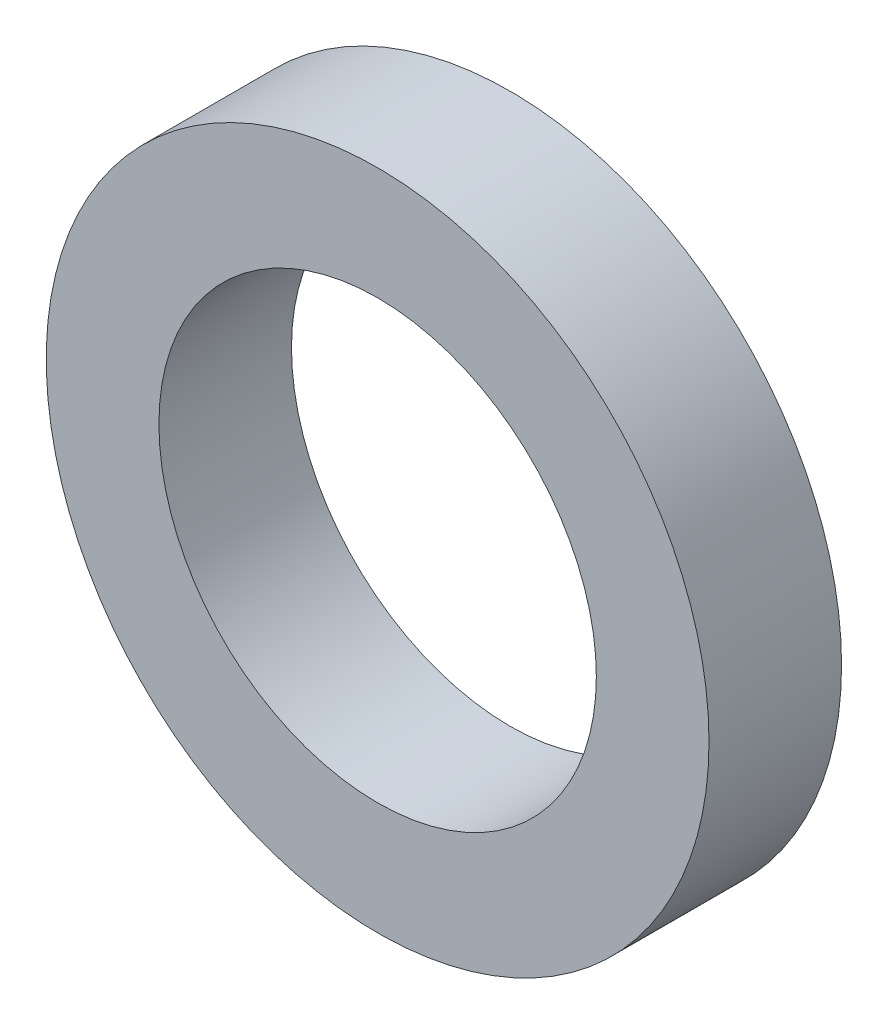
ISO-10303-21;
HEADER;
FILE_DESCRIPTION(('STEP AP214'),'2;1');
FILE_NAME('part.step','',(''),(''),'','','');
FILE_SCHEMA(('AUTOMOTIVE_DESIGN { 1 0 10303 214 1 1 1 1 }'));
ENDSEC;
DATA;
#1=APPLICATION_CONTEXT('core data for automotive mechanical design processes');
#2=APPLICATION_PROTOCOL_DEFINITION('international standard','automotive_design',2000,#1);
#3=PRODUCT_CONTEXT('',#1,'mechanical');
#4=PRODUCT('Part','Part','',(#3));
#5=PRODUCT_RELATED_PRODUCT_CATEGORY('part','',(#4));
#6=PRODUCT_DEFINITION_FORMATION('','',#4);
#7=PRODUCT_DEFINITION_CONTEXT('part definition',#1,'design');
#8=PRODUCT_DEFINITION('design','',#6,#7);
#9=PRODUCT_DEFINITION_SHAPE('','',#8);
#10=(LENGTH_UNIT() NAMED_UNIT(*) SI_UNIT(.MILLI.,.METRE.));
#11=(NAMED_UNIT(*) PLANE_ANGLE_UNIT() SI_UNIT($,.RADIAN.));
#12=(NAMED_UNIT(*) SI_UNIT($,.STERADIAN.) SOLID_ANGLE_UNIT());
#13=UNCERTAINTY_MEASURE_WITH_UNIT(LENGTH_MEASURE(1.E-05),#10,'distance_accuracy_value','');
#14=(GEOMETRIC_REPRESENTATION_CONTEXT(3) GLOBAL_UNCERTAINTY_ASSIGNED_CONTEXT((#13)) GLOBAL_UNIT_ASSIGNED_CONTEXT((#10,
#11,#12)) REPRESENTATION_CONTEXT('',''));
#15=CARTESIAN_POINT('',(0.,0.,0.));
#16=DIRECTION('',(0.,0.,1.));
#17=DIRECTION('',(1.,0.,0.));
#18=AXIS2_PLACEMENT_3D('',#15,#16,#17);
#19=CARTESIAN_POINT('',(0.,0.,2.53999999999999));
#20=DIRECTION('',(0.,0.,1.));
#21=DIRECTION('',(1.,0.,0.));
#22=AXIS2_PLACEMENT_3D('',#19,#20,#21);
#23=PLANE('',#22);
#24=CARTESIAN_POINT('',(0.,0.,2.53999999999999));
#25=DIRECTION('',(0.,0.,1.));
#26=DIRECTION('',(1.,0.,0.));
#27=AXIS2_PLACEMENT_3D('',#24,#25,#26);
#28=CIRCLE('',#27,6.35);
#29=CARTESIAN_POINT('',(6.35,0.,2.53999999999999));
#30=VERTEX_POINT('',#29);
#31=EDGE_CURVE('E10',#30,#30,#28,.T.);
#32=ORIENTED_EDGE('',*,*,#31,.T.);
#33=EDGE_LOOP('',(#32));
#34=FACE_BOUND('',#33,.T.);
#35=CARTESIAN_POINT('',(0.,0.,2.53999999999999));
#36=DIRECTION('',(0.,0.,1.));
#37=DIRECTION('',(1.,0.,0.));
#38=AXIS2_PLACEMENT_3D('',#35,#36,#37);
#39=CIRCLE('',#38,4.191);
#40=CARTESIAN_POINT('',(4.191,0.,2.53999999999999));
#41=VERTEX_POINT('',#40);
#42=EDGE_CURVE('E41',#41,#41,#39,.T.);
#43=ORIENTED_EDGE('',*,*,#42,.F.);
#44=EDGE_LOOP('',(#43));
#45=FACE_BOUND('',#44,.T.);
#46=ADVANCED_FACE('F30',(#34,#45),#23,.T.);
#47=CARTESIAN_POINT('',(0.,0.,0.));
#48=DIRECTION('',(0.,0.,1.));
#49=DIRECTION('',(1.,0.,0.));
#50=AXIS2_PLACEMENT_3D('',#47,#48,#49);
#51=PLANE('',#50);
#52=CARTESIAN_POINT('',(0.,0.,0.));
#53=DIRECTION('',(0.,0.,1.));
#54=DIRECTION('',(1.,0.,0.));
#55=AXIS2_PLACEMENT_3D('',#52,#53,#54);
#56=CIRCLE('',#55,6.35);
#57=CARTESIAN_POINT('',(6.35,0.,0.));
#58=VERTEX_POINT('',#57);
#59=EDGE_CURVE('E34',#58,#58,#56,.T.);
#60=ORIENTED_EDGE('',*,*,#59,.F.);
#61=EDGE_LOOP('',(#60));
#62=FACE_BOUND('',#61,.T.);
#63=CARTESIAN_POINT('',(0.,0.,0.));
#64=DIRECTION('',(0.,0.,1.));
#65=DIRECTION('',(1.,0.,0.));
#66=AXIS2_PLACEMENT_3D('',#63,#64,#65);
#67=CIRCLE('',#66,4.191);
#68=CARTESIAN_POINT('',(4.191,0.,0.));
#69=VERTEX_POINT('',#68);
#70=EDGE_CURVE('E43',#69,#69,#67,.T.);
#71=ORIENTED_EDGE('',*,*,#70,.T.);
#72=EDGE_LOOP('',(#71));
#73=FACE_BOUND('',#72,.T.);
#74=ADVANCED_FACE('F53',(#62,#73),#51,.F.);
#75=CARTESIAN_POINT('',(0.,0.,2.53999999999999));
#76=DIRECTION('',(0.,0.,-1.));
#77=DIRECTION('',(-1.,0.,0.));
#78=AXIS2_PLACEMENT_3D('',#75,#76,#77);
#79=CYLINDRICAL_SURFACE('',#78,6.35);
#80=ORIENTED_EDGE('',*,*,#31,.F.);
#81=EDGE_LOOP('',(#80));
#82=FACE_BOUND('',#81,.T.);
#83=ORIENTED_EDGE('',*,*,#59,.T.);
#84=EDGE_LOOP('',(#83));
#85=FACE_BOUND('',#84,.T.);
#86=ADVANCED_FACE('F32',(#82,#85),#79,.T.);
#87=CARTESIAN_POINT('',(0.,0.,2.53999999999999));
#88=DIRECTION('',(0.,0.,-1.));
#89=DIRECTION('',(-1.,0.,0.));
#90=AXIS2_PLACEMENT_3D('',#87,#88,#89);
#91=CYLINDRICAL_SURFACE('',#90,4.191);
#92=ORIENTED_EDGE('',*,*,#42,.T.);
#93=EDGE_LOOP('',(#92));
#94=FACE_BOUND('',#93,.T.);
#95=ORIENTED_EDGE('',*,*,#70,.F.);
#96=EDGE_LOOP('',(#95));
#97=FACE_BOUND('',#96,.T.);
#98=ADVANCED_FACE('F49',(#94,#97),#91,.F.);
#99=CLOSED_SHELL('',(#46,#74,#86,#98));
#100=MANIFOLD_SOLID_BREP('B2',#99);
#101=ADVANCED_BREP_SHAPE_REPRESENTATION('',(#18,#100),#14);
#102=SHAPE_DEFINITION_REPRESENTATION(#9,#101);
ENDSEC;
END-ISO-10303-21;
